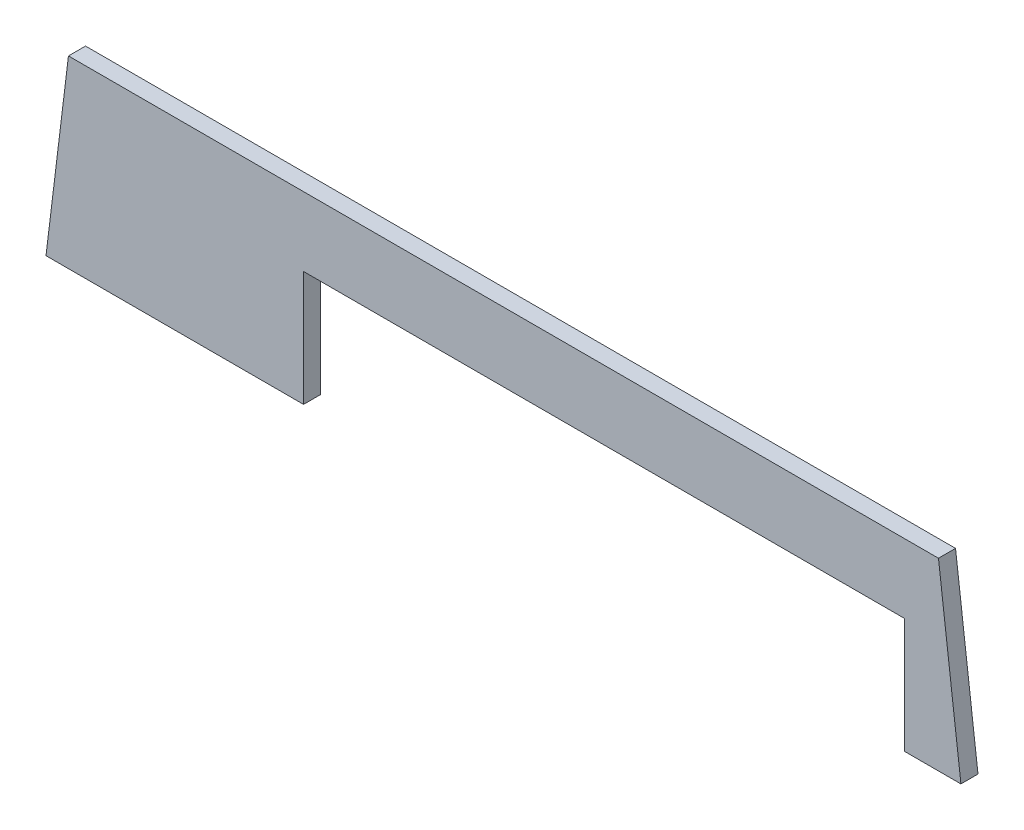
ISO-10303-21;
HEADER;
FILE_DESCRIPTION(('STEP AP214'),'2;1');
FILE_NAME('part.step','',(''),(''),'','','');
FILE_SCHEMA(('AUTOMOTIVE_DESIGN { 1 0 10303 214 1 1 1 1 }'));
ENDSEC;
DATA;
#1=APPLICATION_CONTEXT('core data for automotive mechanical design processes');
#2=APPLICATION_PROTOCOL_DEFINITION('international standard','automotive_design',2000,#1);
#3=PRODUCT_CONTEXT('',#1,'mechanical');
#4=PRODUCT('Part','Part','',(#3));
#5=PRODUCT_RELATED_PRODUCT_CATEGORY('part','',(#4));
#6=PRODUCT_DEFINITION_FORMATION('','',#4);
#7=PRODUCT_DEFINITION_CONTEXT('part definition',#1,'design');
#8=PRODUCT_DEFINITION('design','',#6,#7);
#9=PRODUCT_DEFINITION_SHAPE('','',#8);
#10=(LENGTH_UNIT() NAMED_UNIT(*) SI_UNIT(.MILLI.,.METRE.));
#11=(NAMED_UNIT(*) PLANE_ANGLE_UNIT() SI_UNIT($,.RADIAN.));
#12=(NAMED_UNIT(*) SI_UNIT($,.STERADIAN.) SOLID_ANGLE_UNIT());
#13=UNCERTAINTY_MEASURE_WITH_UNIT(LENGTH_MEASURE(1.E-05),#10,'distance_accuracy_value','');
#14=(GEOMETRIC_REPRESENTATION_CONTEXT(3) GLOBAL_UNCERTAINTY_ASSIGNED_CONTEXT((#13)) GLOBAL_UNIT_ASSIGNED_CONTEXT((#10,
#11,#12)) REPRESENTATION_CONTEXT('',''));
#15=CARTESIAN_POINT('',(0.,0.,0.));
#16=DIRECTION('',(0.,0.,1.));
#17=DIRECTION('',(1.,0.,0.));
#18=AXIS2_PLACEMENT_3D('',#15,#16,#17);
#19=CARTESIAN_POINT('',(571.327966133787,28.0043144358748,10.));
#20=DIRECTION('',(-0.992655640632855,-0.120974291152196,0.));
#21=DIRECTION('',(0.120974291152196,-0.992655640632855,0.));
#22=AXIS2_PLACEMENT_3D('',#19,#20,#21);
#23=PLANE('',#22);
#24=DIRECTION('',(-0.120974291152196,0.992655640632855,0.));
#25=VECTOR('',#24,1.);
#26=CARTESIAN_POINT('',(571.327966133787,28.0043144358748,0.));
#27=LINE('',#26,#25);
#28=CARTESIAN_POINT('',(571.327966133787,28.0043144358748,0.));
#29=VERTEX_POINT('',#28);
#30=CARTESIAN_POINT('',(558.183752245386,135.859280426875,0.));
#31=VERTEX_POINT('',#30);
#32=EDGE_CURVE('E128',#29,#31,#27,.T.);
#33=ORIENTED_EDGE('',*,*,#32,.T.);
#34=DIRECTION('',(0.,0.,-1.));
#35=VECTOR('',#34,1.);
#36=CARTESIAN_POINT('',(558.183752245386,135.859280426875,10.));
#37=LINE('',#36,#35);
#38=CARTESIAN_POINT('',(558.183752245386,135.859280426875,10.));
#39=VERTEX_POINT('',#38);
#40=EDGE_CURVE('E11',#39,#31,#37,.T.);
#41=ORIENTED_EDGE('',*,*,#40,.F.);
#42=DIRECTION('',(-0.120974291152196,0.992655640632855,0.));
#43=VECTOR('',#42,1.);
#44=CARTESIAN_POINT('',(571.327966133787,28.0043144358748,10.));
#45=LINE('',#44,#43);
#46=CARTESIAN_POINT('',(571.327966133787,28.0043144358748,10.));
#47=VERTEX_POINT('',#46);
#48=EDGE_CURVE('E142',#47,#39,#45,.T.);
#49=ORIENTED_EDGE('',*,*,#48,.F.);
#50=DIRECTION('',(0.,0.,-1.));
#51=VECTOR('',#50,1.);
#52=CARTESIAN_POINT('',(571.327966133787,28.0043144358748,10.));
#53=LINE('',#52,#51);
#54=EDGE_CURVE('E124',#47,#29,#53,.T.);
#55=ORIENTED_EDGE('',*,*,#54,.T.);
#56=EDGE_LOOP('',(#33,#41,#49,#55));
#57=FACE_BOUND('',#56,.T.);
#58=ADVANCED_FACE('F32',(#57),#23,.F.);
#59=CARTESIAN_POINT('',(558.183752245386,135.859280426875,10.));
#60=DIRECTION('',(0.,-1.,0.));
#61=DIRECTION('',(0.,0.,-1.));
#62=AXIS2_PLACEMENT_3D('',#59,#60,#61);
#63=PLANE('',#62);
#64=DIRECTION('',(-1.,0.,0.));
#65=VECTOR('',#64,1.);
#66=CARTESIAN_POINT('',(558.183752245386,135.859280426875,0.));
#67=LINE('',#66,#65);
#68=CARTESIAN_POINT('',(48.9139182577857,135.859280426875,0.));
#69=VERTEX_POINT('',#68);
#70=EDGE_CURVE('E131',#31,#69,#67,.T.);
#71=ORIENTED_EDGE('',*,*,#70,.T.);
#72=DIRECTION('',(0.,0.,-1.));
#73=VECTOR('',#72,1.);
#74=CARTESIAN_POINT('',(48.9139182577857,135.859280426875,10.));
#75=LINE('',#74,#73);
#76=CARTESIAN_POINT('',(48.9139182577857,135.859280426875,10.));
#77=VERTEX_POINT('',#76);
#78=EDGE_CURVE('E40',#77,#69,#75,.T.);
#79=ORIENTED_EDGE('',*,*,#78,.F.);
#80=DIRECTION('',(-1.,0.,0.));
#81=VECTOR('',#80,1.);
#82=CARTESIAN_POINT('',(558.183752245386,135.859280426875,10.));
#83=LINE('',#82,#81);
#84=EDGE_CURVE('E91',#39,#77,#83,.T.);
#85=ORIENTED_EDGE('',*,*,#84,.F.);
#86=ORIENTED_EDGE('',*,*,#40,.T.);
#87=EDGE_LOOP('',(#71,#79,#85,#86));
#88=FACE_BOUND('',#87,.T.);
#89=ADVANCED_FACE('F177',(#88),#63,.F.);
#90=CARTESIAN_POINT('',(48.9139182577857,135.859280426875,10.));
#91=DIRECTION('',(0.992655640632855,-0.120974291152192,0.));
#92=DIRECTION('',(0.120974291152192,0.992655640632855,0.));
#93=AXIS2_PLACEMENT_3D('',#90,#91,#92);
#94=PLANE('',#93);
#95=DIRECTION('',(-0.120974291152192,-0.992655640632856,0.));
#96=VECTOR('',#95,1.);
#97=CARTESIAN_POINT('',(48.9139182577857,135.859280426875,0.));
#98=LINE('',#97,#96);
#99=CARTESIAN_POINT('',(35.7697043693857,28.0043144358748,0.));
#100=VERTEX_POINT('',#99);
#101=EDGE_CURVE('E133',#69,#100,#98,.T.);
#102=ORIENTED_EDGE('',*,*,#101,.T.);
#103=DIRECTION('',(0.,0.,-1.));
#104=VECTOR('',#103,1.);
#105=CARTESIAN_POINT('',(35.7697043693857,28.0043144358748,10.));
#106=LINE('',#105,#104);
#107=CARTESIAN_POINT('',(35.7697043693857,28.0043144358748,10.));
#108=VERTEX_POINT('',#107);
#109=EDGE_CURVE('E149',#108,#100,#106,.T.);
#110=ORIENTED_EDGE('',*,*,#109,.F.);
#111=DIRECTION('',(-0.120974291152192,-0.992655640632856,0.));
#112=VECTOR('',#111,1.);
#113=CARTESIAN_POINT('',(48.9139182577857,135.859280426875,10.));
#114=LINE('',#113,#112);
#115=EDGE_CURVE('E157',#77,#108,#114,.T.);
#116=ORIENTED_EDGE('',*,*,#115,.F.);
#117=ORIENTED_EDGE('',*,*,#78,.T.);
#118=EDGE_LOOP('',(#102,#110,#116,#117));
#119=FACE_BOUND('',#118,.T.);
#120=ADVANCED_FACE('F155',(#119),#94,.F.);
#121=CARTESIAN_POINT('',(35.7697043693857,28.0043144358748,10.));
#122=DIRECTION('',(0.,1.,0.));
#123=DIRECTION('',(0.,0.,1.));
#124=AXIS2_PLACEMENT_3D('',#121,#122,#123);
#125=PLANE('',#124);
#126=DIRECTION('',(1.,0.,0.));
#127=VECTOR('',#126,1.);
#128=CARTESIAN_POINT('',(35.7697043693857,28.0043144358748,0.));
#129=LINE('',#128,#127);
#130=CARTESIAN_POINT('',(186.528835251586,28.0043144358748,0.));
#131=VERTEX_POINT('',#130);
#132=EDGE_CURVE('E135',#100,#131,#129,.T.);
#133=ORIENTED_EDGE('',*,*,#132,.T.);
#134=DIRECTION('',(0.,0.,-1.));
#135=VECTOR('',#134,1.);
#136=CARTESIAN_POINT('',(186.528835251586,28.0043144358748,10.));
#137=LINE('',#136,#135);
#138=CARTESIAN_POINT('',(186.528835251586,28.0043144358748,10.));
#139=VERTEX_POINT('',#138);
#140=EDGE_CURVE('E146',#139,#131,#137,.T.);
#141=ORIENTED_EDGE('',*,*,#140,.F.);
#142=DIRECTION('',(1.,0.,0.));
#143=VECTOR('',#142,1.);
#144=CARTESIAN_POINT('',(35.7697043693857,28.0043144358748,10.));
#145=LINE('',#144,#143);
#146=EDGE_CURVE('E169',#108,#139,#145,.T.);
#147=ORIENTED_EDGE('',*,*,#146,.F.);
#148=ORIENTED_EDGE('',*,*,#109,.T.);
#149=EDGE_LOOP('',(#133,#141,#147,#148));
#150=FACE_BOUND('',#149,.T.);
#151=ADVANCED_FACE('F165',(#150),#125,.F.);
#152=CARTESIAN_POINT('',(186.528835251586,28.0043144358748,10.));
#153=DIRECTION('',(-1.,0.,0.));
#154=DIRECTION('',(0.,0.,1.));
#155=AXIS2_PLACEMENT_3D('',#152,#153,#154);
#156=PLANE('',#155);
#157=DIRECTION('',(0.,1.,0.));
#158=VECTOR('',#157,1.);
#159=CARTESIAN_POINT('',(186.528835251586,28.0043144358748,0.));
#160=LINE('',#159,#158);
#161=CARTESIAN_POINT('',(186.528835251586,95.3968978838747,0.));
#162=VERTEX_POINT('',#161);
#163=EDGE_CURVE('E137',#131,#162,#160,.T.);
#164=ORIENTED_EDGE('',*,*,#163,.T.);
#165=DIRECTION('',(0.,0.,-1.));
#166=VECTOR('',#165,1.);
#167=CARTESIAN_POINT('',(186.528835251586,95.3968978838747,10.));
#168=LINE('',#167,#166);
#169=CARTESIAN_POINT('',(186.528835251586,95.3968978838747,10.));
#170=VERTEX_POINT('',#169);
#171=EDGE_CURVE('E119',#170,#162,#168,.T.);
#172=ORIENTED_EDGE('',*,*,#171,.F.);
#173=DIRECTION('',(0.,1.,0.));
#174=VECTOR('',#173,1.);
#175=CARTESIAN_POINT('',(186.528835251586,28.0043144358748,10.));
#176=LINE('',#175,#174);
#177=EDGE_CURVE('E110',#139,#170,#176,.T.);
#178=ORIENTED_EDGE('',*,*,#177,.F.);
#179=ORIENTED_EDGE('',*,*,#140,.T.);
#180=EDGE_LOOP('',(#164,#172,#178,#179));
#181=FACE_BOUND('',#180,.T.);
#182=ADVANCED_FACE('F168',(#181),#156,.F.);
#183=CARTESIAN_POINT('',(186.528835251586,95.3968978838747,10.));
#184=DIRECTION('',(0.,1.,0.));
#185=DIRECTION('',(0.,0.,1.));
#186=AXIS2_PLACEMENT_3D('',#183,#184,#185);
#187=PLANE('',#186);
#188=DIRECTION('',(1.,0.,0.));
#189=VECTOR('',#188,1.);
#190=CARTESIAN_POINT('',(186.528835251586,95.3968978838747,0.));
#191=LINE('',#190,#189);
#192=CARTESIAN_POINT('',(538.316172773086,95.3968978838747,0.));
#193=VERTEX_POINT('',#192);
#194=EDGE_CURVE('E118',#162,#193,#191,.T.);
#195=ORIENTED_EDGE('',*,*,#194,.T.);
#196=DIRECTION('',(0.,0.,-1.));
#197=VECTOR('',#196,1.);
#198=CARTESIAN_POINT('',(538.316172773086,95.3968978838747,10.));
#199=LINE('',#198,#197);
#200=CARTESIAN_POINT('',(538.316172773086,95.3968978838747,10.));
#201=VERTEX_POINT('',#200);
#202=EDGE_CURVE('E115',#201,#193,#199,.T.);
#203=ORIENTED_EDGE('',*,*,#202,.F.);
#204=DIRECTION('',(1.,0.,0.));
#205=VECTOR('',#204,1.);
#206=CARTESIAN_POINT('',(186.528835251586,95.3968978838747,10.));
#207=LINE('',#206,#205);
#208=EDGE_CURVE('E104',#170,#201,#207,.T.);
#209=ORIENTED_EDGE('',*,*,#208,.F.);
#210=ORIENTED_EDGE('',*,*,#171,.T.);
#211=EDGE_LOOP('',(#195,#203,#209,#210));
#212=FACE_BOUND('',#211,.T.);
#213=ADVANCED_FACE('F116',(#212),#187,.F.);
#214=CARTESIAN_POINT('',(538.316172773086,95.3968978838747,10.));
#215=DIRECTION('',(1.,0.,0.));
#216=DIRECTION('',(0.,0.,-1.));
#217=AXIS2_PLACEMENT_3D('',#214,#215,#216);
#218=PLANE('',#217);
#219=DIRECTION('',(0.,-1.,0.));
#220=VECTOR('',#219,1.);
#221=CARTESIAN_POINT('',(538.316172773086,95.3968978838747,0.));
#222=LINE('',#221,#220);
#223=CARTESIAN_POINT('',(538.316172773086,28.0043144358748,0.));
#224=VERTEX_POINT('',#223);
#225=EDGE_CURVE('E77',#193,#224,#222,.T.);
#226=ORIENTED_EDGE('',*,*,#225,.T.);
#227=DIRECTION('',(0.,0.,-1.));
#228=VECTOR('',#227,1.);
#229=CARTESIAN_POINT('',(538.316172773086,28.0043144358748,10.));
#230=LINE('',#229,#228);
#231=CARTESIAN_POINT('',(538.316172773086,28.0043144358748,10.));
#232=VERTEX_POINT('',#231);
#233=EDGE_CURVE('E120',#232,#224,#230,.T.);
#234=ORIENTED_EDGE('',*,*,#233,.F.);
#235=DIRECTION('',(0.,-1.,0.));
#236=VECTOR('',#235,1.);
#237=CARTESIAN_POINT('',(538.316172773086,95.3968978838747,10.));
#238=LINE('',#237,#236);
#239=EDGE_CURVE('E108',#201,#232,#238,.T.);
#240=ORIENTED_EDGE('',*,*,#239,.F.);
#241=ORIENTED_EDGE('',*,*,#202,.T.);
#242=EDGE_LOOP('',(#226,#234,#240,#241));
#243=FACE_BOUND('',#242,.T.);
#244=ADVANCED_FACE('F122',(#243),#218,.F.);
#245=CARTESIAN_POINT('',(538.316172773086,28.0043144358748,10.));
#246=DIRECTION('',(0.,1.,0.));
#247=DIRECTION('',(0.,0.,1.));
#248=AXIS2_PLACEMENT_3D('',#245,#246,#247);
#249=PLANE('',#248);
#250=DIRECTION('',(1.,0.,0.));
#251=VECTOR('',#250,1.);
#252=CARTESIAN_POINT('',(538.316172773086,28.0043144358748,0.));
#253=LINE('',#252,#251);
#254=EDGE_CURVE('E83',#224,#29,#253,.T.);
#255=ORIENTED_EDGE('',*,*,#254,.T.);
#256=ORIENTED_EDGE('',*,*,#54,.F.);
#257=DIRECTION('',(1.,0.,0.));
#258=VECTOR('',#257,1.);
#259=CARTESIAN_POINT('',(538.316172773086,28.0043144358748,10.));
#260=LINE('',#259,#258);
#261=EDGE_CURVE('E48',#232,#47,#260,.T.);
#262=ORIENTED_EDGE('',*,*,#261,.F.);
#263=ORIENTED_EDGE('',*,*,#233,.T.);
#264=EDGE_LOOP('',(#255,#256,#262,#263));
#265=FACE_BOUND('',#264,.T.);
#266=ADVANCED_FACE('F193',(#265),#249,.F.);
#267=CARTESIAN_POINT('',(0.,0.,10.));
#268=DIRECTION('',(0.,0.,1.));
#269=DIRECTION('',(1.,0.,0.));
#270=AXIS2_PLACEMENT_3D('',#267,#268,#269);
#271=PLANE('',#270);
#272=ORIENTED_EDGE('',*,*,#48,.T.);
#273=ORIENTED_EDGE('',*,*,#84,.T.);
#274=ORIENTED_EDGE('',*,*,#115,.T.);
#275=ORIENTED_EDGE('',*,*,#146,.T.);
#276=ORIENTED_EDGE('',*,*,#177,.T.);
#277=ORIENTED_EDGE('',*,*,#208,.T.);
#278=ORIENTED_EDGE('',*,*,#239,.T.);
#279=ORIENTED_EDGE('',*,*,#261,.T.);
#280=EDGE_LOOP('',(#272,#273,#274,#275,#276,#277,#278,#279));
#281=FACE_BOUND('',#280,.T.);
#282=ADVANCED_FACE('F106',(#281),#271,.T.);
#283=CARTESIAN_POINT('',(0.,0.,0.));
#284=DIRECTION('',(0.,0.,1.));
#285=DIRECTION('',(1.,0.,0.));
#286=AXIS2_PLACEMENT_3D('',#283,#284,#285);
#287=PLANE('',#286);
#288=ORIENTED_EDGE('',*,*,#32,.F.);
#289=ORIENTED_EDGE('',*,*,#254,.F.);
#290=ORIENTED_EDGE('',*,*,#225,.F.);
#291=ORIENTED_EDGE('',*,*,#194,.F.);
#292=ORIENTED_EDGE('',*,*,#163,.F.);
#293=ORIENTED_EDGE('',*,*,#132,.F.);
#294=ORIENTED_EDGE('',*,*,#101,.F.);
#295=ORIENTED_EDGE('',*,*,#70,.F.);
#296=EDGE_LOOP('',(#288,#289,#290,#291,#292,#293,#294,#295));
#297=FACE_BOUND('',#296,.T.);
#298=ADVANCED_FACE('F161',(#297),#287,.F.);
#299=CLOSED_SHELL('',(#58,#89,#120,#151,#182,#213,#244,#266,#282,#298));
#300=MANIFOLD_SOLID_BREP('B2',#299);
#301=ADVANCED_BREP_SHAPE_REPRESENTATION('',(#18,#300),#14);
#302=SHAPE_DEFINITION_REPRESENTATION(#9,#301);
ENDSEC;
END-ISO-10303-21;
